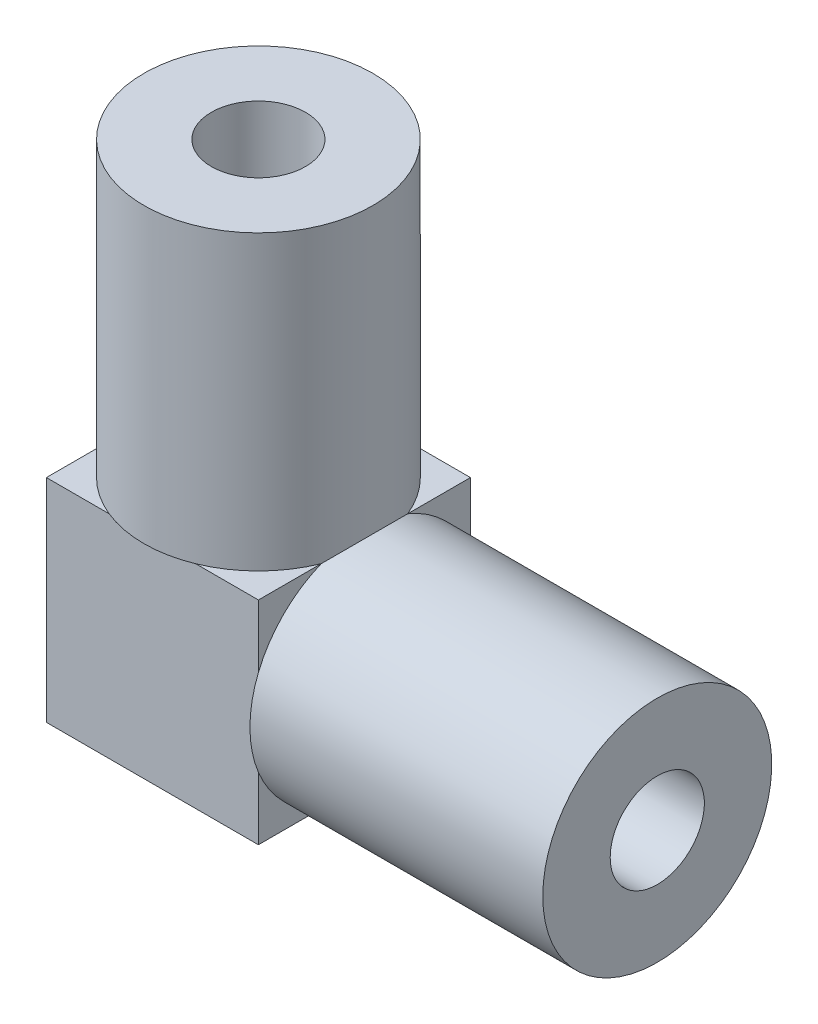
ISO-10303-21;
HEADER;
FILE_DESCRIPTION(('STEP AP214'),'2;1');
FILE_NAME('part.step','',(''),(''),'','','');
FILE_SCHEMA(('AUTOMOTIVE_DESIGN { 1 0 10303 214 1 1 1 1 }'));
ENDSEC;
DATA;
#1=APPLICATION_CONTEXT('core data for automotive mechanical design processes');
#2=APPLICATION_PROTOCOL_DEFINITION('international standard','automotive_design',2000,#1);
#3=PRODUCT_CONTEXT('',#1,'mechanical');
#4=PRODUCT('Part','Part','',(#3));
#5=PRODUCT_RELATED_PRODUCT_CATEGORY('part','',(#4));
#6=PRODUCT_DEFINITION_FORMATION('','',#4);
#7=PRODUCT_DEFINITION_CONTEXT('part definition',#1,'design');
#8=PRODUCT_DEFINITION('design','',#6,#7);
#9=PRODUCT_DEFINITION_SHAPE('','',#8);
#10=(LENGTH_UNIT() NAMED_UNIT(*) SI_UNIT(.MILLI.,.METRE.));
#11=(NAMED_UNIT(*) PLANE_ANGLE_UNIT() SI_UNIT($,.RADIAN.));
#12=(NAMED_UNIT(*) SI_UNIT($,.STERADIAN.) SOLID_ANGLE_UNIT());
#13=UNCERTAINTY_MEASURE_WITH_UNIT(LENGTH_MEASURE(1.E-05),#10,'distance_accuracy_value','');
#14=(GEOMETRIC_REPRESENTATION_CONTEXT(3) GLOBAL_UNCERTAINTY_ASSIGNED_CONTEXT((#13)) GLOBAL_UNIT_ASSIGNED_CONTEXT((#10,
#11,#12)) REPRESENTATION_CONTEXT('',''));
#15=CARTESIAN_POINT('',(0.,0.,0.));
#16=DIRECTION('',(0.,0.,1.));
#17=DIRECTION('',(1.,0.,0.));
#18=AXIS2_PLACEMENT_3D('',#15,#16,#17);
#19=CARTESIAN_POINT('',(7.15,7.15,7.15));
#20=DIRECTION('',(0.,-1.,0.));
#21=DIRECTION('',(0.,0.,-1.));
#22=AXIS2_PLACEMENT_3D('',#19,#20,#21);
#23=PLANE('',#22);
#24=DIRECTION('',(-1.,0.,0.));
#25=VECTOR('',#24,1.);
#26=CARTESIAN_POINT('',(7.15,7.15,-7.15));
#27=LINE('',#26,#25);
#28=CARTESIAN_POINT('',(7.15,7.15,-7.15));
#29=VERTEX_POINT('',#28);
#30=CARTESIAN_POINT('',(2.91663916177508,7.14999999999999,-7.15));
#31=VERTEX_POINT('',#30);
#32=EDGE_CURVE('E159',#29,#31,#27,.T.);
#33=ORIENTED_EDGE('',*,*,#32,.T.);
#34=CARTESIAN_POINT('',(0.,7.14999999999999,0.));
#35=DIRECTION('',(0.,-1.,0.));
#36=DIRECTION('',(0.,0.,-1.));
#37=AXIS2_PLACEMENT_3D('',#34,#35,#36);
#38=CIRCLE('',#37,7.722);
#39=CARTESIAN_POINT('',(7.14999999999999,7.14999999999999,-2.9166391617751));
#40=VERTEX_POINT('',#39);
#41=EDGE_CURVE('E150',#31,#40,#38,.T.);
#42=ORIENTED_EDGE('',*,*,#41,.T.);
#43=DIRECTION('',(0.,0.,-1.));
#44=VECTOR('',#43,1.);
#45=CARTESIAN_POINT('',(7.15,7.15,7.15));
#46=LINE('',#45,#44);
#47=EDGE_CURVE('E164',#40,#29,#46,.T.);
#48=ORIENTED_EDGE('',*,*,#47,.T.);
#49=EDGE_LOOP('',(#33,#42,#48));
#50=FACE_BOUND('',#49,.T.);
#51=ADVANCED_FACE('F41',(#50),#23,.F.);
#52=CARTESIAN_POINT('',(7.15,7.15,7.15));
#53=VERTEX_POINT('',#52);
#54=CARTESIAN_POINT('',(7.14999999999999,7.15,2.91663916177508));
#55=VERTEX_POINT('',#54);
#56=EDGE_CURVE('E179',#53,#55,#46,.T.);
#57=ORIENTED_EDGE('',*,*,#56,.T.);
#58=CARTESIAN_POINT('',(2.91663916177508,7.14999999999999,7.15));
#59=VERTEX_POINT('',#58);
#60=EDGE_CURVE('E153',#55,#59,#38,.T.);
#61=ORIENTED_EDGE('',*,*,#60,.T.);
#62=DIRECTION('',(-1.,0.,0.));
#63=VECTOR('',#62,1.);
#64=CARTESIAN_POINT('',(7.15,7.15,7.15));
#65=LINE('',#64,#63);
#66=EDGE_CURVE('E218',#53,#59,#65,.T.);
#67=ORIENTED_EDGE('',*,*,#66,.F.);
#68=EDGE_LOOP('',(#57,#61,#67));
#69=FACE_BOUND('',#68,.T.);
#70=ADVANCED_FACE('F270',(#69),#23,.F.);
#71=CARTESIAN_POINT('',(-2.91663916177508,7.14999999999999,7.15));
#72=VERTEX_POINT('',#71);
#73=CARTESIAN_POINT('',(-7.15,7.15,7.15));
#74=VERTEX_POINT('',#73);
#75=EDGE_CURVE('E69',#72,#74,#65,.T.);
#76=ORIENTED_EDGE('',*,*,#75,.F.);
#77=CARTESIAN_POINT('',(-7.15,7.14999999999999,2.91663916177508));
#78=VERTEX_POINT('',#77);
#79=EDGE_CURVE('E271',#72,#78,#38,.T.);
#80=ORIENTED_EDGE('',*,*,#79,.T.);
#81=DIRECTION('',(0.,0.,-1.));
#82=VECTOR('',#81,1.);
#83=CARTESIAN_POINT('',(-7.15,7.15,7.15));
#84=LINE('',#83,#82);
#85=EDGE_CURVE('E174',#74,#78,#84,.T.);
#86=ORIENTED_EDGE('',*,*,#85,.F.);
#87=EDGE_LOOP('',(#76,#80,#86));
#88=FACE_BOUND('',#87,.T.);
#89=ADVANCED_FACE('F299',(#88),#23,.F.);
#90=CARTESIAN_POINT('',(7.15,-7.15,7.15));
#91=DIRECTION('',(-1.,0.,0.));
#92=DIRECTION('',(0.,0.,1.));
#93=AXIS2_PLACEMENT_3D('',#90,#91,#92);
#94=PLANE('',#93);
#95=DIRECTION('',(0.,1.,0.));
#96=VECTOR('',#95,1.);
#97=CARTESIAN_POINT('',(7.15,-7.15,7.15));
#98=LINE('',#97,#96);
#99=CARTESIAN_POINT('',(7.14999999999999,2.91663916177508,7.15));
#100=VERTEX_POINT('',#99);
#101=EDGE_CURVE('E212',#100,#53,#98,.T.);
#102=ORIENTED_EDGE('',*,*,#101,.F.);
#103=CARTESIAN_POINT('',(7.14999999999999,0.,0.));
#104=DIRECTION('',(-1.,0.,0.));
#105=DIRECTION('',(0.,0.,1.));
#106=AXIS2_PLACEMENT_3D('',#103,#104,#105);
#107=CIRCLE('',#106,7.722);
#108=EDGE_CURVE('E202',#100,#55,#107,.T.);
#109=ORIENTED_EDGE('',*,*,#108,.T.);
#110=ORIENTED_EDGE('',*,*,#56,.F.);
#111=EDGE_LOOP('',(#102,#109,#110));
#112=FACE_BOUND('',#111,.T.);
#113=ADVANCED_FACE('F263',(#112),#94,.F.);
#114=ORIENTED_EDGE('',*,*,#47,.F.);
#115=CARTESIAN_POINT('',(7.14999999999999,2.91663916177508,-7.15));
#116=VERTEX_POINT('',#115);
#117=EDGE_CURVE('E49',#40,#116,#107,.T.);
#118=ORIENTED_EDGE('',*,*,#117,.T.);
#119=DIRECTION('',(0.,1.,0.));
#120=VECTOR('',#119,1.);
#121=CARTESIAN_POINT('',(7.15,-7.15,-7.15));
#122=LINE('',#121,#120);
#123=EDGE_CURVE('E221',#116,#29,#122,.T.);
#124=ORIENTED_EDGE('',*,*,#123,.T.);
#125=EDGE_LOOP('',(#114,#118,#124));
#126=FACE_BOUND('',#125,.T.);
#127=ADVANCED_FACE('F244',(#126),#94,.F.);
#128=CARTESIAN_POINT('',(7.15,-7.15,-7.15));
#129=VERTEX_POINT('',#128);
#130=CARTESIAN_POINT('',(7.14999999999999,-2.91663916177508,-7.15));
#131=VERTEX_POINT('',#130);
#132=EDGE_CURVE('E168',#129,#131,#122,.T.);
#133=ORIENTED_EDGE('',*,*,#132,.T.);
#134=CARTESIAN_POINT('',(7.14999999999999,-7.15,-2.91663916177508));
#135=VERTEX_POINT('',#134);
#136=EDGE_CURVE('E231',#131,#135,#107,.T.);
#137=ORIENTED_EDGE('',*,*,#136,.T.);
#138=DIRECTION('',(0.,0.,-1.));
#139=VECTOR('',#138,1.);
#140=CARTESIAN_POINT('',(7.15,-7.15,7.15));
#141=LINE('',#140,#139);
#142=EDGE_CURVE('E178',#135,#129,#141,.T.);
#143=ORIENTED_EDGE('',*,*,#142,.T.);
#144=EDGE_LOOP('',(#133,#137,#143));
#145=FACE_BOUND('',#144,.T.);
#146=ADVANCED_FACE('F235',(#145),#94,.F.);
#147=CARTESIAN_POINT('',(-7.15,7.15,7.15));
#148=DIRECTION('',(1.,0.,0.));
#149=DIRECTION('',(0.,0.,-1.));
#150=AXIS2_PLACEMENT_3D('',#147,#148,#149);
#151=PLANE('',#150);
#152=DIRECTION('',(0.,-1.,0.));
#153=VECTOR('',#152,1.);
#154=CARTESIAN_POINT('',(-7.15,7.15,-7.15));
#155=LINE('',#154,#153);
#156=CARTESIAN_POINT('',(-7.15,7.15,-7.15));
#157=VERTEX_POINT('',#156);
#158=CARTESIAN_POINT('',(-7.15,-7.15,-7.15));
#159=VERTEX_POINT('',#158);
#160=EDGE_CURVE('E211',#157,#159,#155,.T.);
#161=ORIENTED_EDGE('',*,*,#160,.T.);
#162=DIRECTION('',(0.,0.,-1.));
#163=VECTOR('',#162,1.);
#164=CARTESIAN_POINT('',(-7.15,-7.15,7.15));
#165=LINE('',#164,#163);
#166=CARTESIAN_POINT('',(-7.15,-7.15,7.15));
#167=VERTEX_POINT('',#166);
#168=EDGE_CURVE('E184',#167,#159,#165,.T.);
#169=ORIENTED_EDGE('',*,*,#168,.F.);
#170=DIRECTION('',(0.,-1.,0.));
#171=VECTOR('',#170,1.);
#172=CARTESIAN_POINT('',(-7.15,7.15,7.15));
#173=LINE('',#172,#171);
#174=EDGE_CURVE('E170',#74,#167,#173,.T.);
#175=ORIENTED_EDGE('',*,*,#174,.F.);
#176=ORIENTED_EDGE('',*,*,#85,.T.);
#177=DIRECTION('',(0.,0.,-1.));
#178=VECTOR('',#177,1.);
#179=CARTESIAN_POINT('',(-7.15,7.15,7.15));
#180=LINE('',#179,#178);
#181=CARTESIAN_POINT('',(-7.15,7.14999999999999,-2.91663916177508));
#182=VERTEX_POINT('',#181);
#183=EDGE_CURVE('E201',#78,#182,#180,.T.);
#184=ORIENTED_EDGE('',*,*,#183,.T.);
#185=EDGE_CURVE('E89',#182,#157,#84,.T.);
#186=ORIENTED_EDGE('',*,*,#185,.T.);
#187=EDGE_LOOP('',(#161,#169,#175,#176,#184,#186));
#188=FACE_BOUND('',#187,.T.);
#189=ADVANCED_FACE('F43',(#188),#151,.F.);
#190=CARTESIAN_POINT('',(-7.15,-7.15,7.15));
#191=DIRECTION('',(0.,1.,0.));
#192=DIRECTION('',(0.,0.,1.));
#193=AXIS2_PLACEMENT_3D('',#190,#191,#192);
#194=PLANE('',#193);
#195=DIRECTION('',(1.,0.,0.));
#196=VECTOR('',#195,1.);
#197=CARTESIAN_POINT('',(-7.15,-7.15,-7.15));
#198=LINE('',#197,#196);
#199=EDGE_CURVE('E225',#159,#129,#198,.T.);
#200=ORIENTED_EDGE('',*,*,#199,.T.);
#201=ORIENTED_EDGE('',*,*,#142,.F.);
#202=CARTESIAN_POINT('',(7.14999999999999,-7.15,2.91663916177508));
#203=VERTEX_POINT('',#202);
#204=EDGE_CURVE('E183',#203,#135,#141,.T.);
#205=ORIENTED_EDGE('',*,*,#204,.F.);
#206=CARTESIAN_POINT('',(7.15,-7.15,7.15));
#207=VERTEX_POINT('',#206);
#208=EDGE_CURVE('E182',#207,#203,#141,.T.);
#209=ORIENTED_EDGE('',*,*,#208,.F.);
#210=DIRECTION('',(1.,0.,0.));
#211=VECTOR('',#210,1.);
#212=CARTESIAN_POINT('',(-7.15,-7.15,7.15));
#213=LINE('',#212,#211);
#214=EDGE_CURVE('E98',#167,#207,#213,.T.);
#215=ORIENTED_EDGE('',*,*,#214,.F.);
#216=ORIENTED_EDGE('',*,*,#168,.T.);
#217=EDGE_LOOP('',(#200,#201,#205,#209,#215,#216));
#218=FACE_BOUND('',#217,.T.);
#219=ADVANCED_FACE('F254',(#218),#194,.F.);
#220=ORIENTED_EDGE('',*,*,#208,.T.);
#221=CARTESIAN_POINT('',(7.14999999999999,-2.91663916177508,7.15));
#222=VERTEX_POINT('',#221);
#223=EDGE_CURVE('E187',#203,#222,#107,.T.);
#224=ORIENTED_EDGE('',*,*,#223,.T.);
#225=EDGE_CURVE('E214',#207,#222,#98,.T.);
#226=ORIENTED_EDGE('',*,*,#225,.F.);
#227=EDGE_LOOP('',(#220,#224,#226));
#228=FACE_BOUND('',#227,.T.);
#229=ADVANCED_FACE('F250',(#228),#94,.F.);
#230=ORIENTED_EDGE('',*,*,#185,.F.);
#231=CARTESIAN_POINT('',(-2.91663916177508,7.14999999999999,-7.15));
#232=VERTEX_POINT('',#231);
#233=EDGE_CURVE('E145',#182,#232,#38,.T.);
#234=ORIENTED_EDGE('',*,*,#233,.T.);
#235=EDGE_CURVE('E161',#232,#157,#27,.T.);
#236=ORIENTED_EDGE('',*,*,#235,.T.);
#237=EDGE_LOOP('',(#230,#234,#236));
#238=FACE_BOUND('',#237,.T.);
#239=ADVANCED_FACE('F278',(#238),#23,.F.);
#240=CARTESIAN_POINT('',(0.,0.,7.15));
#241=DIRECTION('',(0.,0.,1.));
#242=DIRECTION('',(1.,0.,0.));
#243=AXIS2_PLACEMENT_3D('',#240,#241,#242);
#244=PLANE('',#243);
#245=ORIENTED_EDGE('',*,*,#174,.T.);
#246=ORIENTED_EDGE('',*,*,#214,.T.);
#247=ORIENTED_EDGE('',*,*,#225,.T.);
#248=EDGE_CURVE('E217',#222,#100,#98,.T.);
#249=ORIENTED_EDGE('',*,*,#248,.T.);
#250=ORIENTED_EDGE('',*,*,#101,.T.);
#251=ORIENTED_EDGE('',*,*,#66,.T.);
#252=DIRECTION('',(1.,0.,0.));
#253=VECTOR('',#252,1.);
#254=CARTESIAN_POINT('',(0.,7.15,7.15));
#255=LINE('',#254,#253);
#256=EDGE_CURVE('E165',#72,#59,#255,.T.);
#257=ORIENTED_EDGE('',*,*,#256,.F.);
#258=ORIENTED_EDGE('',*,*,#75,.T.);
#259=EDGE_LOOP('',(#245,#246,#247,#249,#250,#251,#257,#258));
#260=FACE_BOUND('',#259,.T.);
#261=ADVANCED_FACE('F253',(#260),#244,.T.);
#262=CARTESIAN_POINT('',(0.,0.,-7.15));
#263=DIRECTION('',(0.,0.,1.));
#264=DIRECTION('',(1.,0.,0.));
#265=AXIS2_PLACEMENT_3D('',#262,#263,#264);
#266=PLANE('',#265);
#267=ORIENTED_EDGE('',*,*,#160,.F.);
#268=ORIENTED_EDGE('',*,*,#235,.F.);
#269=DIRECTION('',(1.,0.,0.));
#270=VECTOR('',#269,1.);
#271=CARTESIAN_POINT('',(0.,7.15,-7.15));
#272=LINE('',#271,#270);
#273=EDGE_CURVE('E143',#232,#31,#272,.T.);
#274=ORIENTED_EDGE('',*,*,#273,.T.);
#275=ORIENTED_EDGE('',*,*,#32,.F.);
#276=ORIENTED_EDGE('',*,*,#123,.F.);
#277=EDGE_CURVE('E230',#131,#116,#122,.T.);
#278=ORIENTED_EDGE('',*,*,#277,.F.);
#279=ORIENTED_EDGE('',*,*,#132,.F.);
#280=ORIENTED_EDGE('',*,*,#199,.F.);
#281=EDGE_LOOP('',(#267,#268,#274,#275,#276,#278,#279,#280));
#282=FACE_BOUND('',#281,.T.);
#283=ADVANCED_FACE('F158',(#282),#266,.F.);
#284=CARTESIAN_POINT('',(7.15,7.722,0.));
#285=DIRECTION('',(1.,0.,0.));
#286=DIRECTION('',(0.,0.,-1.));
#287=AXIS2_PLACEMENT_3D('',#284,#285,#286);
#288=PLANE('',#287);
#289=EDGE_CURVE('E207',#116,#131,#107,.T.);
#290=ORIENTED_EDGE('',*,*,#289,.T.);
#291=ORIENTED_EDGE('',*,*,#277,.T.);
#292=EDGE_LOOP('',(#290,#291));
#293=FACE_BOUND('',#292,.T.);
#294=ADVANCED_FACE('F239',(#293),#288,.F.);
#295=EDGE_CURVE('E243',#135,#203,#107,.T.);
#296=ORIENTED_EDGE('',*,*,#295,.T.);
#297=ORIENTED_EDGE('',*,*,#204,.T.);
#298=EDGE_LOOP('',(#296,#297));
#299=FACE_BOUND('',#298,.T.);
#300=ADVANCED_FACE('F260',(#299),#288,.F.);
#301=ORIENTED_EDGE('',*,*,#248,.F.);
#302=EDGE_CURVE('E59',#222,#100,#107,.T.);
#303=ORIENTED_EDGE('',*,*,#302,.T.);
#304=EDGE_LOOP('',(#301,#303));
#305=FACE_BOUND('',#304,.T.);
#306=ADVANCED_FACE('F259',(#305),#288,.F.);
#307=CARTESIAN_POINT('',(26.9,0.,0.));
#308=DIRECTION('',(-1.,0.,0.));
#309=DIRECTION('',(0.,0.,1.));
#310=AXIS2_PLACEMENT_3D('',#307,#308,#309);
#311=PLANE('',#310);
#312=CARTESIAN_POINT('',(26.8999999999999,0.,0.));
#313=DIRECTION('',(-1.,0.,0.));
#314=DIRECTION('',(0.,0.,1.));
#315=AXIS2_PLACEMENT_3D('',#312,#313,#314);
#316=CIRCLE('',#315,3.175);
#317=CARTESIAN_POINT('',(26.8999999999999,0.,3.175));
#318=VERTEX_POINT('',#317);
#319=EDGE_CURVE('E190',#318,#318,#316,.F.);
#320=ORIENTED_EDGE('',*,*,#319,.F.);
#321=EDGE_LOOP('',(#320));
#322=FACE_BOUND('',#321,.T.);
#323=CARTESIAN_POINT('',(26.8999999999999,0.,0.));
#324=DIRECTION('',(-1.,0.,0.));
#325=DIRECTION('',(0.,0.,1.));
#326=AXIS2_PLACEMENT_3D('',#323,#324,#325);
#327=CIRCLE('',#326,7.722);
#328=CARTESIAN_POINT('',(26.8999999999999,0.,7.722));
#329=VERTEX_POINT('',#328);
#330=EDGE_CURVE('E208',#329,#329,#327,.T.);
#331=ORIENTED_EDGE('',*,*,#330,.F.);
#332=EDGE_LOOP('',(#331));
#333=FACE_BOUND('',#332,.T.);
#334=ADVANCED_FACE('F286',(#322,#333),#311,.F.);
#335=CARTESIAN_POINT('',(-1000.,0.,0.));
#336=DIRECTION('',(-1.,0.,0.));
#337=DIRECTION('',(0.,0.,1.));
#338=AXIS2_PLACEMENT_3D('',#335,#336,#337);
#339=CYLINDRICAL_SURFACE('',#338,7.722);
#340=ORIENTED_EDGE('',*,*,#117,.F.);
#341=CARTESIAN_POINT('',(0.,0.,0.));
#342=DIRECTION('',(-0.707106781186547,0.707106781186547,0.));
#343=DIRECTION('',(-0.707106781186547,-0.707106781186547,0.));
#344=AXIS2_PLACEMENT_3D('',#341,#342,#343);
#345=ELLIPSE('',#344,10.920557128645,7.722);
#346=EDGE_CURVE('E11',#40,#55,#345,.F.);
#347=ORIENTED_EDGE('',*,*,#346,.T.);
#348=ORIENTED_EDGE('',*,*,#108,.F.);
#349=ORIENTED_EDGE('',*,*,#302,.F.);
#350=ORIENTED_EDGE('',*,*,#223,.F.);
#351=ORIENTED_EDGE('',*,*,#295,.F.);
#352=ORIENTED_EDGE('',*,*,#136,.F.);
#353=ORIENTED_EDGE('',*,*,#289,.F.);
#354=EDGE_LOOP('',(#340,#347,#348,#349,#350,#351,#352,#353));
#355=FACE_BOUND('',#354,.T.);
#356=ORIENTED_EDGE('',*,*,#330,.T.);
#357=EDGE_LOOP('',(#356));
#358=FACE_BOUND('',#357,.T.);
#359=ADVANCED_FACE('F238',(#355,#358),#339,.T.);
#360=CARTESIAN_POINT('',(0.,7.15,0.));
#361=DIRECTION('',(0.,-1.,0.));
#362=DIRECTION('',(0.,0.,-1.));
#363=AXIS2_PLACEMENT_3D('',#360,#361,#362);
#364=PLANE('',#363);
#365=ORIENTED_EDGE('',*,*,#183,.F.);
#366=EDGE_CURVE('E273',#78,#182,#38,.T.);
#367=ORIENTED_EDGE('',*,*,#366,.T.);
#368=EDGE_LOOP('',(#365,#367));
#369=FACE_BOUND('',#368,.T.);
#370=ADVANCED_FACE('F282',(#369),#364,.T.);
#371=ORIENTED_EDGE('',*,*,#273,.F.);
#372=EDGE_CURVE('E139',#232,#31,#38,.T.);
#373=ORIENTED_EDGE('',*,*,#372,.T.);
#374=EDGE_LOOP('',(#371,#373));
#375=FACE_BOUND('',#374,.T.);
#376=ADVANCED_FACE('F136',(#375),#364,.T.);
#377=EDGE_CURVE('E267',#59,#72,#38,.T.);
#378=ORIENTED_EDGE('',*,*,#377,.T.);
#379=ORIENTED_EDGE('',*,*,#256,.T.);
#380=EDGE_LOOP('',(#378,#379));
#381=FACE_BOUND('',#380,.T.);
#382=ADVANCED_FACE('F284',(#381),#364,.T.);
#383=CARTESIAN_POINT('',(0.,-500.,0.));
#384=DIRECTION('',(0.,-1.,0.));
#385=DIRECTION('',(0.,0.,-1.));
#386=AXIS2_PLACEMENT_3D('',#383,#384,#385);
#387=CYLINDRICAL_SURFACE('',#386,7.722);
#388=CARTESIAN_POINT('',(0.,26.9,0.));
#389=DIRECTION('',(0.,-1.,0.));
#390=DIRECTION('',(0.,0.,-1.));
#391=AXIS2_PLACEMENT_3D('',#388,#389,#390);
#392=CIRCLE('',#391,7.722);
#393=CARTESIAN_POINT('',(0.,26.9,-7.722));
#394=VERTEX_POINT('',#393);
#395=EDGE_CURVE('E144',#394,#394,#392,.T.);
#396=ORIENTED_EDGE('',*,*,#395,.T.);
#397=EDGE_LOOP('',(#396));
#398=FACE_BOUND('',#397,.T.);
#399=ORIENTED_EDGE('',*,*,#346,.F.);
#400=ORIENTED_EDGE('',*,*,#41,.F.);
#401=ORIENTED_EDGE('',*,*,#372,.F.);
#402=ORIENTED_EDGE('',*,*,#233,.F.);
#403=ORIENTED_EDGE('',*,*,#366,.F.);
#404=ORIENTED_EDGE('',*,*,#79,.F.);
#405=ORIENTED_EDGE('',*,*,#377,.F.);
#406=ORIENTED_EDGE('',*,*,#60,.F.);
#407=EDGE_LOOP('',(#399,#400,#401,#402,#403,#404,#405,#406));
#408=FACE_BOUND('',#407,.T.);
#409=ADVANCED_FACE('F149',(#398,#408),#387,.T.);
#410=CARTESIAN_POINT('',(7.722,26.9,0.));
#411=DIRECTION('',(0.,1.,0.));
#412=DIRECTION('',(0.,0.,1.));
#413=AXIS2_PLACEMENT_3D('',#410,#411,#412);
#414=PLANE('',#413);
#415=CARTESIAN_POINT('',(0.,26.9,0.));
#416=DIRECTION('',(0.,1.,0.));
#417=DIRECTION('',(0.,0.,1.));
#418=AXIS2_PLACEMENT_3D('',#415,#416,#417);
#419=CIRCLE('',#418,3.175);
#420=CARTESIAN_POINT('',(0.,26.9,3.175));
#421=VERTEX_POINT('',#420);
#422=EDGE_CURVE('E44',#421,#421,#419,.T.);
#423=ORIENTED_EDGE('',*,*,#422,.F.);
#424=EDGE_LOOP('',(#423));
#425=FACE_BOUND('',#424,.T.);
#426=ORIENTED_EDGE('',*,*,#395,.F.);
#427=EDGE_LOOP('',(#426));
#428=FACE_BOUND('',#427,.T.);
#429=ADVANCED_FACE('F404',(#425,#428),#414,.T.);
#430=CARTESIAN_POINT('',(-1000.,0.,0.));
#431=DIRECTION('',(-1.,0.,0.));
#432=DIRECTION('',(0.,0.,1.));
#433=AXIS2_PLACEMENT_3D('',#430,#431,#432);
#434=CYLINDRICAL_SURFACE('',#433,3.175);
#435=CARTESIAN_POINT('',(11.7,0.,0.));
#436=DIRECTION('',(-1.,0.,0.));
#437=DIRECTION('',(0.,0.,1.));
#438=AXIS2_PLACEMENT_3D('',#435,#436,#437);
#439=CIRCLE('',#438,3.175);
#440=CARTESIAN_POINT('',(11.7,0.,3.175));
#441=VERTEX_POINT('',#440);
#442=EDGE_CURVE('E189',#441,#441,#439,.T.);
#443=ORIENTED_EDGE('',*,*,#442,.T.);
#444=EDGE_LOOP('',(#443));
#445=FACE_BOUND('',#444,.T.);
#446=ORIENTED_EDGE('',*,*,#319,.T.);
#447=EDGE_LOOP('',(#446));
#448=FACE_BOUND('',#447,.T.);
#449=ADVANCED_FACE('F414',(#445,#448),#434,.F.);
#450=CARTESIAN_POINT('',(11.7,3.175,0.));
#451=DIRECTION('',(1.,0.,0.));
#452=DIRECTION('',(0.,0.,-1.));
#453=AXIS2_PLACEMENT_3D('',#450,#451,#452);
#454=PLANE('',#453);
#455=ORIENTED_EDGE('',*,*,#442,.F.);
#456=EDGE_LOOP('',(#455));
#457=FACE_BOUND('',#456,.T.);
#458=ADVANCED_FACE('F423',(#457),#454,.T.);
#459=CARTESIAN_POINT('',(0.,11.7,0.));
#460=DIRECTION('',(0.,-1.,0.));
#461=DIRECTION('',(0.,0.,-1.));
#462=AXIS2_PLACEMENT_3D('',#459,#460,#461);
#463=PLANE('',#462);
#464=CARTESIAN_POINT('',(0.,11.7,0.));
#465=DIRECTION('',(0.,-1.,0.));
#466=DIRECTION('',(0.,0.,-1.));
#467=AXIS2_PLACEMENT_3D('',#464,#465,#466);
#468=CIRCLE('',#467,3.175);
#469=CARTESIAN_POINT('',(0.,11.7,-3.175));
#470=VERTEX_POINT('',#469);
#471=EDGE_CURVE('E200',#470,#470,#468,.T.);
#472=ORIENTED_EDGE('',*,*,#471,.F.);
#473=EDGE_LOOP('',(#472));
#474=FACE_BOUND('',#473,.T.);
#475=ADVANCED_FACE('F427',(#474),#463,.F.);
#476=CARTESIAN_POINT('',(0.,-500.,0.));
#477=DIRECTION('',(0.,-1.,0.));
#478=DIRECTION('',(0.,0.,-1.));
#479=AXIS2_PLACEMENT_3D('',#476,#477,#478);
#480=CYLINDRICAL_SURFACE('',#479,3.175);
#481=ORIENTED_EDGE('',*,*,#422,.T.);
#482=EDGE_LOOP('',(#481));
#483=FACE_BOUND('',#482,.T.);
#484=ORIENTED_EDGE('',*,*,#471,.T.);
#485=EDGE_LOOP('',(#484));
#486=FACE_BOUND('',#485,.T.);
#487=ADVANCED_FACE('F437',(#483,#486),#480,.F.);
#488=CLOSED_SHELL('',(#51,#70,#89,#113,#127,#146,#189,#219,#229,#239,#261,#283,#294,#300,#306,
#334,#359,#370,#376,#382,#409,#429,#449,#458,#475,#487));
#489=MANIFOLD_SOLID_BREP('B2',#488);
#490=ADVANCED_BREP_SHAPE_REPRESENTATION('',(#18,#489),#14);
#491=SHAPE_DEFINITION_REPRESENTATION(#9,#490);
ENDSEC;
END-ISO-10303-21;
